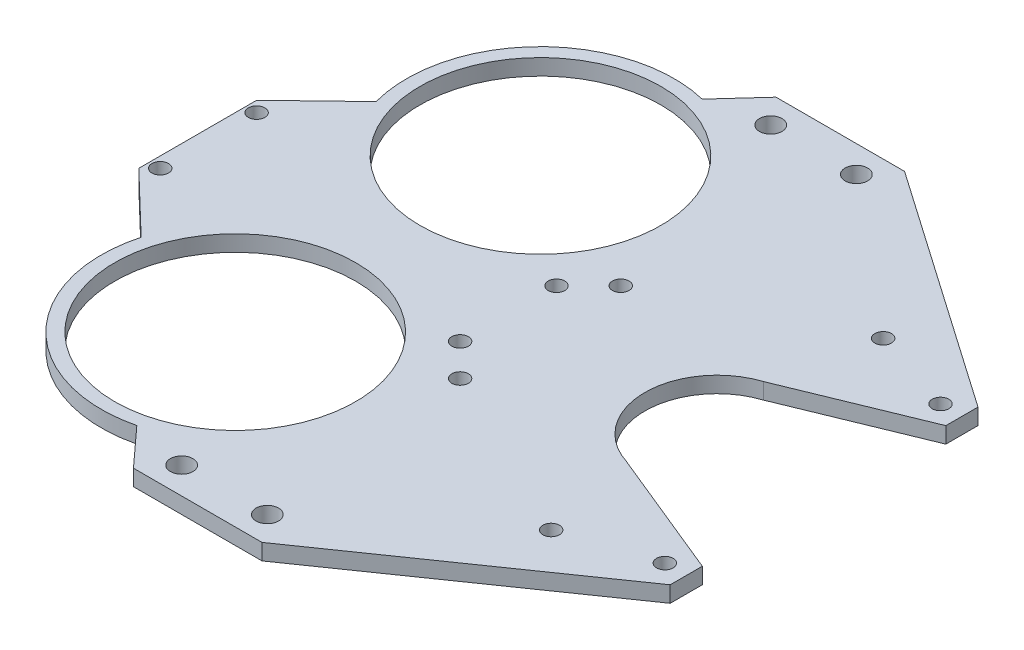
ISO-10303-21;
HEADER;
FILE_DESCRIPTION(('STEP AP214'),'2;1');
FILE_NAME('part.step','',(''),(''),'','','');
FILE_SCHEMA(('AUTOMOTIVE_DESIGN { 1 0 10303 214 1 1 1 1 }'));
ENDSEC;
DATA;
#1=APPLICATION_CONTEXT('core data for automotive mechanical design processes');
#2=APPLICATION_PROTOCOL_DEFINITION('international standard','automotive_design',2000,#1);
#3=PRODUCT_CONTEXT('',#1,'mechanical');
#4=PRODUCT('Part','Part','',(#3));
#5=PRODUCT_RELATED_PRODUCT_CATEGORY('part','',(#4));
#6=PRODUCT_DEFINITION_FORMATION('','',#4);
#7=PRODUCT_DEFINITION_CONTEXT('part definition',#1,'design');
#8=PRODUCT_DEFINITION('design','',#6,#7);
#9=PRODUCT_DEFINITION_SHAPE('','',#8);
#10=(LENGTH_UNIT() NAMED_UNIT(*) SI_UNIT(.MILLI.,.METRE.));
#11=(NAMED_UNIT(*) PLANE_ANGLE_UNIT() SI_UNIT($,.RADIAN.));
#12=(NAMED_UNIT(*) SI_UNIT($,.STERADIAN.) SOLID_ANGLE_UNIT());
#13=UNCERTAINTY_MEASURE_WITH_UNIT(LENGTH_MEASURE(1.E-05),#10,'distance_accuracy_value','');
#14=(GEOMETRIC_REPRESENTATION_CONTEXT(3) GLOBAL_UNCERTAINTY_ASSIGNED_CONTEXT((#13)) GLOBAL_UNIT_ASSIGNED_CONTEXT((#10,
#11,#12)) REPRESENTATION_CONTEXT('',''));
#15=CARTESIAN_POINT('',(0.,0.,0.));
#16=DIRECTION('',(0.,0.,1.));
#17=DIRECTION('',(1.,0.,0.));
#18=AXIS2_PLACEMENT_3D('',#15,#16,#17);
#19=CARTESIAN_POINT('',(0.,3.,0.));
#20=DIRECTION('',(0.,1.,0.));
#21=DIRECTION('',(0.,0.,1.));
#22=AXIS2_PLACEMENT_3D('',#19,#20,#21);
#23=PLANE('',#22);
#24=CARTESIAN_POINT('',(42.,3.,31.));
#25=DIRECTION('',(0.,-1.,0.));
#26=DIRECTION('',(0.,0.,-1.));
#27=AXIS2_PLACEMENT_3D('',#24,#25,#26);
#28=CIRCLE('',#27,1.55);
#29=CARTESIAN_POINT('',(42.,3.,29.45));
#30=VERTEX_POINT('',#29);
#31=EDGE_CURVE('E258',#30,#30,#28,.T.);
#32=ORIENTED_EDGE('',*,*,#31,.T.);
#33=EDGE_LOOP('',(#32));
#34=FACE_BOUND('',#33,.T.);
#35=CARTESIAN_POINT('',(9.,3.,15.));
#36=DIRECTION('',(0.,-1.,0.));
#37=DIRECTION('',(0.,0.,-1.));
#38=AXIS2_PLACEMENT_3D('',#35,#36,#37);
#39=CIRCLE('',#38,1.55);
#40=CARTESIAN_POINT('',(9.,3.,13.45));
#41=VERTEX_POINT('',#40);
#42=EDGE_CURVE('E263',#41,#41,#39,.T.);
#43=ORIENTED_EDGE('',*,*,#42,.T.);
#44=EDGE_LOOP('',(#43));
#45=FACE_BOUND('',#44,.T.);
#46=CARTESIAN_POINT('',(57.9755346439581,3.,25.7398332578328));
#47=DIRECTION('',(0.,-1.,0.));
#48=DIRECTION('',(0.,0.,-1.));
#49=AXIS2_PLACEMENT_3D('',#46,#47,#48);
#50=CIRCLE('',#49,1.55);
#51=CARTESIAN_POINT('',(57.9755346439581,3.,24.1898332578328));
#52=VERTEX_POINT('',#51);
#53=EDGE_CURVE('E255',#52,#52,#50,.T.);
#54=ORIENTED_EDGE('',*,*,#53,.T.);
#55=EDGE_LOOP('',(#54));
#56=FACE_BOUND('',#55,.T.);
#57=CARTESIAN_POINT('',(42.,3.,-31.));
#58=DIRECTION('',(0.,1.,0.));
#59=DIRECTION('',(0.,0.,1.));
#60=AXIS2_PLACEMENT_3D('',#57,#58,#59);
#61=CIRCLE('',#60,1.55);
#62=CARTESIAN_POINT('',(42.,3.,-29.45));
#63=VERTEX_POINT('',#62);
#64=EDGE_CURVE('E249',#63,#63,#61,.T.);
#65=ORIENTED_EDGE('',*,*,#64,.F.);
#66=EDGE_LOOP('',(#65));
#67=FACE_BOUND('',#66,.T.);
#68=CARTESIAN_POINT('',(9.,3.,-15.));
#69=DIRECTION('',(0.,1.,0.));
#70=DIRECTION('',(0.,0.,1.));
#71=AXIS2_PLACEMENT_3D('',#68,#69,#70);
#72=CIRCLE('',#71,1.55);
#73=CARTESIAN_POINT('',(9.,3.,-13.45));
#74=VERTEX_POINT('',#73);
#75=EDGE_CURVE('E254',#74,#74,#72,.T.);
#76=ORIENTED_EDGE('',*,*,#75,.F.);
#77=EDGE_LOOP('',(#76));
#78=FACE_BOUND('',#77,.T.);
#79=CARTESIAN_POINT('',(57.9755346439581,3.,-25.7398332578328));
#80=DIRECTION('',(0.,1.,0.));
#81=DIRECTION('',(0.,0.,1.));
#82=AXIS2_PLACEMENT_3D('',#79,#80,#81);
#83=CIRCLE('',#82,1.55);
#84=CARTESIAN_POINT('',(57.9755346439581,3.,-24.1898332578328));
#85=VERTEX_POINT('',#84);
#86=EDGE_CURVE('E244',#85,#85,#83,.T.);
#87=ORIENTED_EDGE('',*,*,#86,.F.);
#88=EDGE_LOOP('',(#87));
#89=FACE_BOUND('',#88,.T.);
#90=CARTESIAN_POINT('',(-53.,3.,-9.));
#91=DIRECTION('',(0.,1.,0.));
#92=DIRECTION('',(0.,0.,1.));
#93=AXIS2_PLACEMENT_3D('',#90,#91,#92);
#94=CIRCLE('',#93,1.55);
#95=CARTESIAN_POINT('',(-53.,3.,-7.45));
#96=VERTEX_POINT('',#95);
#97=EDGE_CURVE('E234',#96,#96,#94,.T.);
#98=ORIENTED_EDGE('',*,*,#97,.F.);
#99=EDGE_LOOP('',(#98));
#100=FACE_BOUND('',#99,.T.);
#101=CARTESIAN_POINT('',(3.,3.,-9.));
#102=DIRECTION('',(0.,1.,0.));
#103=DIRECTION('',(0.,0.,1.));
#104=AXIS2_PLACEMENT_3D('',#101,#102,#103);
#105=CIRCLE('',#104,1.55);
#106=CARTESIAN_POINT('',(3.,3.,-7.45));
#107=VERTEX_POINT('',#106);
#108=EDGE_CURVE('E280',#107,#107,#105,.T.);
#109=ORIENTED_EDGE('',*,*,#108,.F.);
#110=EDGE_LOOP('',(#109));
#111=FACE_BOUND('',#110,.T.);
#112=CARTESIAN_POINT('',(3.,3.,9.));
#113=DIRECTION('',(0.,1.,0.));
#114=DIRECTION('',(0.,0.,1.));
#115=AXIS2_PLACEMENT_3D('',#112,#113,#114);
#116=CIRCLE('',#115,1.55);
#117=CARTESIAN_POINT('',(3.,3.,10.55));
#118=VERTEX_POINT('',#117);
#119=EDGE_CURVE('E243',#118,#118,#116,.T.);
#120=ORIENTED_EDGE('',*,*,#119,.F.);
#121=EDGE_LOOP('',(#120));
#122=FACE_BOUND('',#121,.T.);
#123=CARTESIAN_POINT('',(-53.,3.,9.));
#124=DIRECTION('',(0.,1.,0.));
#125=DIRECTION('',(0.,0.,1.));
#126=AXIS2_PLACEMENT_3D('',#123,#124,#125);
#127=CIRCLE('',#126,1.55);
#128=CARTESIAN_POINT('',(-53.,3.,10.55));
#129=VERTEX_POINT('',#128);
#130=EDGE_CURVE('E229',#129,#129,#127,.T.);
#131=ORIENTED_EDGE('',*,*,#130,.F.);
#132=EDGE_LOOP('',(#131));
#133=FACE_BOUND('',#132,.T.);
#134=CARTESIAN_POINT('',(-19.5,3.,28.5));
#135=DIRECTION('',(0.,-1.,0.));
#136=DIRECTION('',(0.,0.,-1.));
#137=AXIS2_PLACEMENT_3D('',#134,#135,#136);
#138=CIRCLE('',#137,22.5);
#139=CARTESIAN_POINT('',(-19.5,3.,6.00000000000002));
#140=VERTEX_POINT('',#139);
#141=EDGE_CURVE('E296',#140,#140,#138,.T.);
#142=ORIENTED_EDGE('',*,*,#141,.T.);
#143=EDGE_LOOP('',(#142));
#144=FACE_BOUND('',#143,.T.);
#145=CARTESIAN_POINT('',(-19.5,3.,-28.5));
#146=DIRECTION('',(0.,1.,0.));
#147=DIRECTION('',(0.,0.,1.));
#148=AXIS2_PLACEMENT_3D('',#145,#146,#147);
#149=CIRCLE('',#148,22.5);
#150=CARTESIAN_POINT('',(-19.5,3.,-6.00000000000002));
#151=VERTEX_POINT('',#150);
#152=EDGE_CURVE('E300',#151,#151,#149,.T.);
#153=ORIENTED_EDGE('',*,*,#152,.F.);
#154=EDGE_LOOP('',(#153));
#155=FACE_BOUND('',#154,.T.);
#156=CARTESIAN_POINT('',(-3.00000000000002,3.,-55.));
#157=DIRECTION('',(0.,1.,0.));
#158=DIRECTION('',(0.,0.,1.));
#159=AXIS2_PLACEMENT_3D('',#156,#157,#158);
#160=CIRCLE('',#159,2.1);
#161=CARTESIAN_POINT('',(-3.00000000000002,3.,-52.9));
#162=VERTEX_POINT('',#161);
#163=EDGE_CURVE('E304',#162,#162,#160,.T.);
#164=ORIENTED_EDGE('',*,*,#163,.F.);
#165=EDGE_LOOP('',(#164));
#166=FACE_BOUND('',#165,.T.);
#167=CARTESIAN_POINT('',(13.,3.,-55.));
#168=DIRECTION('',(0.,1.,0.));
#169=DIRECTION('',(0.,0.,1.));
#170=AXIS2_PLACEMENT_3D('',#167,#168,#169);
#171=CIRCLE('',#170,2.1);
#172=CARTESIAN_POINT('',(13.,3.,-52.9));
#173=VERTEX_POINT('',#172);
#174=EDGE_CURVE('E308',#173,#173,#171,.T.);
#175=ORIENTED_EDGE('',*,*,#174,.F.);
#176=EDGE_LOOP('',(#175));
#177=FACE_BOUND('',#176,.T.);
#178=CARTESIAN_POINT('',(13.,3.,55.));
#179=DIRECTION('',(0.,-1.,0.));
#180=DIRECTION('',(0.,0.,-1.));
#181=AXIS2_PLACEMENT_3D('',#178,#179,#180);
#182=CIRCLE('',#181,2.1);
#183=CARTESIAN_POINT('',(13.,3.,52.9));
#184=VERTEX_POINT('',#183);
#185=EDGE_CURVE('E312',#184,#184,#182,.T.);
#186=ORIENTED_EDGE('',*,*,#185,.T.);
#187=EDGE_LOOP('',(#186));
#188=FACE_BOUND('',#187,.T.);
#189=CARTESIAN_POINT('',(-3.00000000000002,3.,55.));
#190=DIRECTION('',(0.,-1.,0.));
#191=DIRECTION('',(0.,0.,-1.));
#192=AXIS2_PLACEMENT_3D('',#189,#190,#191);
#193=CIRCLE('',#192,2.1);
#194=CARTESIAN_POINT('',(-3.00000000000002,3.,52.9));
#195=VERTEX_POINT('',#194);
#196=EDGE_CURVE('E315',#195,#195,#193,.T.);
#197=ORIENTED_EDGE('',*,*,#196,.T.);
#198=EDGE_LOOP('',(#197));
#199=FACE_BOUND('',#198,.T.);
#200=DIRECTION('',(-0.925256138398603,0.,0.379342956117159));
#201=VECTOR('',#200,1.);
#202=CARTESIAN_POINT('',(61.9755346439581,3.,-22.7398332578328));
#203=LINE('',#202,#201);
#204=CARTESIAN_POINT('',(61.9755346439581,3.00000000000003,-22.7398332578328));
#205=VERTEX_POINT('',#204);
#206=CARTESIAN_POINT('',(37.8222951308566,3.,-12.8373198926542));
#207=VERTEX_POINT('',#206);
#208=EDGE_CURVE('E53',#205,#207,#203,.T.);
#209=ORIENTED_EDGE('',*,*,#208,.F.);
#210=DIRECTION('',(0.,0.,1.));
#211=VECTOR('',#210,1.);
#212=CARTESIAN_POINT('',(61.9755346439581,3.,-28.7398332578328));
#213=LINE('',#212,#211);
#214=CARTESIAN_POINT('',(61.9755346439581,3.00000000000006,-28.7398332578328));
#215=VERTEX_POINT('',#214);
#216=EDGE_CURVE('E169',#215,#205,#213,.T.);
#217=ORIENTED_EDGE('',*,*,#216,.F.);
#218=DIRECTION('',(-0.821137607991091,0.,-0.570730259179123));
#219=VECTOR('',#218,1.);
#220=CARTESIAN_POINT('',(17.,3.,-60.));
#221=LINE('',#220,#219);
#222=CARTESIAN_POINT('',(17.,3.,-60.));
#223=VERTEX_POINT('',#222);
#224=EDGE_CURVE('E222',#215,#223,#221,.T.);
#225=ORIENTED_EDGE('',*,*,#224,.T.);
#226=DIRECTION('',(-1.,0.,0.));
#227=VECTOR('',#226,1.);
#228=CARTESIAN_POINT('',(17.,3.,-60.));
#229=LINE('',#228,#227);
#230=CARTESIAN_POINT('',(-7.00000000000002,3.,-60.));
#231=VERTEX_POINT('',#230);
#232=EDGE_CURVE('E350',#223,#231,#229,.T.);
#233=ORIENTED_EDGE('',*,*,#232,.T.);
#234=DIRECTION('',(-0.674073225767098,0.,0.738664528933087));
#235=VECTOR('',#234,1.);
#236=CARTESIAN_POINT('',(-7.00000000000002,3.,-60.));
#237=LINE('',#236,#235);
#238=CARTESIAN_POINT('',(-13.5803943583106,3.,-52.7890565697163));
#239=VERTEX_POINT('',#238);
#240=EDGE_CURVE('E356',#231,#239,#237,.T.);
#241=ORIENTED_EDGE('',*,*,#240,.T.);
#242=CARTESIAN_POINT('',(-19.5,3.,-28.5));
#243=DIRECTION('',(0.,1.,0.));
#244=DIRECTION('',(0.,0.,1.));
#245=AXIS2_PLACEMENT_3D('',#242,#243,#244);
#246=CIRCLE('',#245,25.);
#247=CARTESIAN_POINT('',(-43.624805935291,3.,-21.9430389215318));
#248=VERTEX_POINT('',#247);
#249=EDGE_CURVE('E391',#239,#248,#246,.T.);
#250=ORIENTED_EDGE('',*,*,#249,.T.);
#251=DIRECTION('',(0.720663628318464,0.,-0.693284887199243));
#252=VECTOR('',#251,1.);
#253=CARTESIAN_POINT('',(-31.9312936399787,3.,-33.1923028416974));
#254=LINE('',#253,#252);
#255=CARTESIAN_POINT('',(-55.,3.,-11.));
#256=VERTEX_POINT('',#255);
#257=EDGE_CURVE('E367',#256,#248,#254,.T.);
#258=ORIENTED_EDGE('',*,*,#257,.F.);
#259=DIRECTION('',(0.,0.,1.));
#260=VECTOR('',#259,1.);
#261=CARTESIAN_POINT('',(-55.,3.,0.));
#262=LINE('',#261,#260);
#263=CARTESIAN_POINT('',(-55.,3.,11.));
#264=VERTEX_POINT('',#263);
#265=EDGE_CURVE('E369',#256,#264,#262,.T.);
#266=ORIENTED_EDGE('',*,*,#265,.T.);
#267=DIRECTION('',(0.720663628318464,0.,0.693284887199243));
#268=VECTOR('',#267,1.);
#269=CARTESIAN_POINT('',(-31.9312936399787,3.,33.1923028416974));
#270=LINE('',#269,#268);
#271=CARTESIAN_POINT('',(-43.624805935291,3.,21.9430389215318));
#272=VERTEX_POINT('',#271);
#273=EDGE_CURVE('E372',#264,#272,#270,.T.);
#274=ORIENTED_EDGE('',*,*,#273,.T.);
#275=CARTESIAN_POINT('',(-19.5,3.,28.5));
#276=DIRECTION('',(0.,-1.,0.));
#277=DIRECTION('',(0.,0.,-1.));
#278=AXIS2_PLACEMENT_3D('',#275,#276,#277);
#279=CIRCLE('',#278,25.);
#280=CARTESIAN_POINT('',(-13.5803943583106,3.,52.7890565697163));
#281=VERTEX_POINT('',#280);
#282=EDGE_CURVE('E406',#281,#272,#279,.T.);
#283=ORIENTED_EDGE('',*,*,#282,.F.);
#284=DIRECTION('',(-0.674073225767098,0.,-0.738664528933087));
#285=VECTOR('',#284,1.);
#286=CARTESIAN_POINT('',(-7.00000000000002,3.,60.));
#287=LINE('',#286,#285);
#288=CARTESIAN_POINT('',(-7.00000000000002,3.,60.));
#289=VERTEX_POINT('',#288);
#290=EDGE_CURVE('E328',#289,#281,#287,.T.);
#291=ORIENTED_EDGE('',*,*,#290,.F.);
#292=DIRECTION('',(-1.,0.,0.));
#293=VECTOR('',#292,1.);
#294=CARTESIAN_POINT('',(17.,3.,60.));
#295=LINE('',#294,#293);
#296=CARTESIAN_POINT('',(17.,3.,60.));
#297=VERTEX_POINT('',#296);
#298=EDGE_CURVE('E334',#297,#289,#295,.T.);
#299=ORIENTED_EDGE('',*,*,#298,.F.);
#300=DIRECTION('',(0.821137607991222,0.,-0.570730259178934));
#301=VECTOR('',#300,1.);
#302=CARTESIAN_POINT('',(17.,3.,60.));
#303=LINE('',#302,#301);
#304=CARTESIAN_POINT('',(61.9755462252569,3.,28.7398211835021));
#305=VERTEX_POINT('',#304);
#306=EDGE_CURVE('E86',#297,#305,#303,.T.);
#307=ORIENTED_EDGE('',*,*,#306,.T.);
#308=DIRECTION('',(0.,0.,1.));
#309=VECTOR('',#308,1.);
#310=CARTESIAN_POINT('',(61.975534643958,3.,28.7398332578328));
#311=LINE('',#310,#309);
#312=CARTESIAN_POINT('',(61.975534643958,3.00000000000006,22.7398332578328));
#313=VERTEX_POINT('',#312);
#314=EDGE_CURVE('E76',#313,#305,#311,.T.);
#315=ORIENTED_EDGE('',*,*,#314,.F.);
#316=DIRECTION('',(0.925256138398603,0.,0.379342956117159));
#317=VECTOR('',#316,1.);
#318=CARTESIAN_POINT('',(61.975534643958,3.,22.7398332578328));
#319=LINE('',#318,#317);
#320=CARTESIAN_POINT('',(37.8222951308565,3.,12.8373198926542));
#321=VERTEX_POINT('',#320);
#322=EDGE_CURVE('E168',#321,#313,#319,.T.);
#323=ORIENTED_EDGE('',*,*,#322,.F.);
#324=CARTESIAN_POINT('',(42.,3.,0.));
#325=DIRECTION('',(0.,1.,0.));
#326=DIRECTION('',(0.,0.,1.));
#327=AXIS2_PLACEMENT_3D('',#324,#325,#326);
#328=CIRCLE('',#327,13.5);
#329=EDGE_CURVE('E164',#207,#321,#328,.T.);
#330=ORIENTED_EDGE('',*,*,#329,.F.);
#331=EDGE_LOOP('',(#209,#217,#225,#233,#241,#250,#258,#266,#274,#283,#291,#299,#307,#315,#323,#330));
#332=FACE_BOUND('',#331,.T.);
#333=ADVANCED_FACE('F36',(#34,#45,#56,#67,#78,#89,#100,#111,#122,#133,#144,#155,#166,#177,#188,
#199,#332),#23,.T.);
#334=CARTESIAN_POINT('',(42.,0.,0.));
#335=DIRECTION('',(0.,1.,0.));
#336=DIRECTION('',(0.,0.,1.));
#337=AXIS2_PLACEMENT_3D('',#334,#335,#336);
#338=CYLINDRICAL_SURFACE('',#337,13.5);
#339=DIRECTION('',(0.,1.,0.));
#340=VECTOR('',#339,1.);
#341=CARTESIAN_POINT('',(37.8222951308565,0.,12.8373198926542));
#342=LINE('',#341,#340);
#343=CARTESIAN_POINT('',(37.8222951308566,0.,12.8373198926542));
#344=VERTEX_POINT('',#343);
#345=EDGE_CURVE('E45',#344,#321,#342,.T.);
#346=ORIENTED_EDGE('',*,*,#345,.F.);
#347=CARTESIAN_POINT('',(42.,0.,0.));
#348=DIRECTION('',(0.,1.,0.));
#349=DIRECTION('',(0.,0.,1.));
#350=AXIS2_PLACEMENT_3D('',#347,#348,#349);
#351=CIRCLE('',#350,13.5);
#352=CARTESIAN_POINT('',(37.8222951308565,0.,-12.8373198926542));
#353=VERTEX_POINT('',#352);
#354=EDGE_CURVE('E152',#353,#344,#351,.T.);
#355=ORIENTED_EDGE('',*,*,#354,.F.);
#356=DIRECTION('',(0.,1.,0.));
#357=VECTOR('',#356,1.);
#358=CARTESIAN_POINT('',(37.8222951308566,0.,-12.8373198926542));
#359=LINE('',#358,#357);
#360=EDGE_CURVE('E11',#207,#353,#359,.F.);
#361=ORIENTED_EDGE('',*,*,#360,.F.);
#362=ORIENTED_EDGE('',*,*,#329,.T.);
#363=EDGE_LOOP('',(#346,#355,#361,#362));
#364=FACE_BOUND('',#363,.T.);
#365=ADVANCED_FACE('F161',(#364),#338,.F.);
#366=CARTESIAN_POINT('',(-31.9312936399787,3.,-33.1923028416974));
#367=DIRECTION('',(-0.693284887199243,0.,-0.720663628318464));
#368=DIRECTION('',(-0.720663628318464,0.,0.693284887199243));
#369=AXIS2_PLACEMENT_3D('',#366,#367,#368);
#370=PLANE('',#369);
#371=ORIENTED_EDGE('',*,*,#257,.T.);
#372=DIRECTION('',(0.,-1.,0.));
#373=VECTOR('',#372,1.);
#374=CARTESIAN_POINT('',(-43.624805935291,3.,-21.9430389215318));
#375=LINE('',#374,#373);
#376=CARTESIAN_POINT('',(-43.624805935291,0.,-21.9430389215318));
#377=VERTEX_POINT('',#376);
#378=EDGE_CURVE('E397',#248,#377,#375,.T.);
#379=ORIENTED_EDGE('',*,*,#378,.T.);
#380=DIRECTION('',(0.720663628318464,0.,-0.693284887199243));
#381=VECTOR('',#380,1.);
#382=CARTESIAN_POINT('',(-31.9312936399787,0.,-33.1923028416974));
#383=LINE('',#382,#381);
#384=CARTESIAN_POINT('',(-55.,0.,-11.));
#385=VERTEX_POINT('',#384);
#386=EDGE_CURVE('E365',#385,#377,#383,.T.);
#387=ORIENTED_EDGE('',*,*,#386,.F.);
#388=DIRECTION('',(0.,-1.,0.));
#389=VECTOR('',#388,1.);
#390=CARTESIAN_POINT('',(-55.,3.,-11.));
#391=LINE('',#390,#389);
#392=EDGE_CURVE('E383',#256,#385,#391,.T.);
#393=ORIENTED_EDGE('',*,*,#392,.F.);
#394=EDGE_LOOP('',(#371,#379,#387,#393));
#395=FACE_BOUND('',#394,.T.);
#396=ADVANCED_FACE('F38',(#395),#370,.T.);
#397=CARTESIAN_POINT('',(-7.00000000000002,0.,-60.));
#398=DIRECTION('',(-0.738664528933087,0.,-0.674073225767098));
#399=DIRECTION('',(-0.674073225767098,0.,0.738664528933087));
#400=AXIS2_PLACEMENT_3D('',#397,#398,#399);
#401=PLANE('',#400);
#402=DIRECTION('',(-0.674073225767098,0.,0.738664528933087));
#403=VECTOR('',#402,1.);
#404=CARTESIAN_POINT('',(-7.00000000000002,0.,-60.));
#405=LINE('',#404,#403);
#406=CARTESIAN_POINT('',(-7.00000000000002,0.,-60.));
#407=VERTEX_POINT('',#406);
#408=CARTESIAN_POINT('',(-13.5803943583106,0.,-52.7890565697163));
#409=VERTEX_POINT('',#408);
#410=EDGE_CURVE('E355',#407,#409,#405,.T.);
#411=ORIENTED_EDGE('',*,*,#410,.T.);
#412=DIRECTION('',(0.,-1.,0.));
#413=VECTOR('',#412,1.);
#414=CARTESIAN_POINT('',(-13.5803943583106,3.,-52.7890565697163));
#415=LINE('',#414,#413);
#416=EDGE_CURVE('E394',#239,#409,#415,.T.);
#417=ORIENTED_EDGE('',*,*,#416,.F.);
#418=ORIENTED_EDGE('',*,*,#240,.F.);
#419=DIRECTION('',(0.,1.,0.));
#420=VECTOR('',#419,1.);
#421=CARTESIAN_POINT('',(-7.00000000000002,0.,-60.));
#422=LINE('',#421,#420);
#423=EDGE_CURVE('E363',#407,#231,#422,.T.);
#424=ORIENTED_EDGE('',*,*,#423,.F.);
#425=EDGE_LOOP('',(#411,#417,#418,#424));
#426=FACE_BOUND('',#425,.T.);
#427=ADVANCED_FACE('F424',(#426),#401,.T.);
#428=CARTESIAN_POINT('',(0.,0.,0.));
#429=DIRECTION('',(0.,1.,0.));
#430=DIRECTION('',(0.,0.,1.));
#431=AXIS2_PLACEMENT_3D('',#428,#429,#430);
#432=PLANE('',#431);
#433=CARTESIAN_POINT('',(42.,0.,31.));
#434=DIRECTION('',(0.,1.,0.));
#435=DIRECTION('',(0.,0.,1.));
#436=AXIS2_PLACEMENT_3D('',#433,#434,#435);
#437=CIRCLE('',#436,1.55);
#438=CARTESIAN_POINT('',(42.,0.,32.55));
#439=VERTEX_POINT('',#438);
#440=EDGE_CURVE('E40',#439,#439,#437,.F.);
#441=ORIENTED_EDGE('',*,*,#440,.F.);
#442=EDGE_LOOP('',(#441));
#443=FACE_BOUND('',#442,.T.);
#444=CARTESIAN_POINT('',(9.,0.,15.));
#445=DIRECTION('',(0.,1.,0.));
#446=DIRECTION('',(0.,0.,1.));
#447=AXIS2_PLACEMENT_3D('',#444,#445,#446);
#448=CIRCLE('',#447,1.55);
#449=CARTESIAN_POINT('',(9.,0.,16.55));
#450=VERTEX_POINT('',#449);
#451=EDGE_CURVE('E256',#450,#450,#448,.F.);
#452=ORIENTED_EDGE('',*,*,#451,.F.);
#453=EDGE_LOOP('',(#452));
#454=FACE_BOUND('',#453,.T.);
#455=CARTESIAN_POINT('',(57.9755346439581,0.,25.7398332578328));
#456=DIRECTION('',(0.,1.,0.));
#457=DIRECTION('',(0.,0.,1.));
#458=AXIS2_PLACEMENT_3D('',#455,#456,#457);
#459=CIRCLE('',#458,1.55);
#460=CARTESIAN_POINT('',(57.9755346439581,0.,27.2898332578328));
#461=VERTEX_POINT('',#460);
#462=EDGE_CURVE('E252',#461,#461,#459,.F.);
#463=ORIENTED_EDGE('',*,*,#462,.F.);
#464=EDGE_LOOP('',(#463));
#465=FACE_BOUND('',#464,.T.);
#466=CARTESIAN_POINT('',(42.,0.,-31.));
#467=DIRECTION('',(0.,1.,0.));
#468=DIRECTION('',(0.,0.,1.));
#469=AXIS2_PLACEMENT_3D('',#466,#467,#468);
#470=CIRCLE('',#469,1.55);
#471=CARTESIAN_POINT('',(42.,0.,-29.45));
#472=VERTEX_POINT('',#471);
#473=EDGE_CURVE('E248',#472,#472,#470,.T.);
#474=ORIENTED_EDGE('',*,*,#473,.T.);
#475=EDGE_LOOP('',(#474));
#476=FACE_BOUND('',#475,.T.);
#477=CARTESIAN_POINT('',(9.,0.,-15.));
#478=DIRECTION('',(0.,1.,0.));
#479=DIRECTION('',(0.,0.,1.));
#480=AXIS2_PLACEMENT_3D('',#477,#478,#479);
#481=CIRCLE('',#480,1.55);
#482=CARTESIAN_POINT('',(9.,0.,-13.45));
#483=VERTEX_POINT('',#482);
#484=EDGE_CURVE('E245',#483,#483,#481,.T.);
#485=ORIENTED_EDGE('',*,*,#484,.T.);
#486=EDGE_LOOP('',(#485));
#487=FACE_BOUND('',#486,.T.);
#488=CARTESIAN_POINT('',(57.9755346439581,0.,-25.7398332578328));
#489=DIRECTION('',(0.,1.,0.));
#490=DIRECTION('',(0.,0.,1.));
#491=AXIS2_PLACEMENT_3D('',#488,#489,#490);
#492=CIRCLE('',#491,1.55);
#493=CARTESIAN_POINT('',(57.9755346439581,0.,-24.1898332578328));
#494=VERTEX_POINT('',#493);
#495=EDGE_CURVE('E240',#494,#494,#492,.T.);
#496=ORIENTED_EDGE('',*,*,#495,.T.);
#497=EDGE_LOOP('',(#496));
#498=FACE_BOUND('',#497,.T.);
#499=CARTESIAN_POINT('',(-53.,0.,-9.));
#500=DIRECTION('',(0.,1.,0.));
#501=DIRECTION('',(0.,0.,1.));
#502=AXIS2_PLACEMENT_3D('',#499,#500,#501);
#503=CIRCLE('',#502,1.55);
#504=CARTESIAN_POINT('',(-53.,0.,-7.45));
#505=VERTEX_POINT('',#504);
#506=EDGE_CURVE('E237',#505,#505,#503,.T.);
#507=ORIENTED_EDGE('',*,*,#506,.T.);
#508=EDGE_LOOP('',(#507));
#509=FACE_BOUND('',#508,.T.);
#510=CARTESIAN_POINT('',(3.,0.,-9.));
#511=DIRECTION('',(0.,1.,0.));
#512=DIRECTION('',(0.,0.,1.));
#513=AXIS2_PLACEMENT_3D('',#510,#511,#512);
#514=CIRCLE('',#513,1.55);
#515=CARTESIAN_POINT('',(3.,0.,-7.45));
#516=VERTEX_POINT('',#515);
#517=EDGE_CURVE('E233',#516,#516,#514,.T.);
#518=ORIENTED_EDGE('',*,*,#517,.T.);
#519=EDGE_LOOP('',(#518));
#520=FACE_BOUND('',#519,.T.);
#521=CARTESIAN_POINT('',(3.,0.,9.));
#522=DIRECTION('',(0.,1.,0.));
#523=DIRECTION('',(0.,0.,1.));
#524=AXIS2_PLACEMENT_3D('',#521,#522,#523);
#525=CIRCLE('',#524,1.55);
#526=CARTESIAN_POINT('',(3.,0.,10.55));
#527=VERTEX_POINT('',#526);
#528=EDGE_CURVE('E230',#527,#527,#525,.T.);
#529=ORIENTED_EDGE('',*,*,#528,.T.);
#530=EDGE_LOOP('',(#529));
#531=FACE_BOUND('',#530,.T.);
#532=CARTESIAN_POINT('',(-53.,0.,9.));
#533=DIRECTION('',(0.,1.,0.));
#534=DIRECTION('',(0.,0.,1.));
#535=AXIS2_PLACEMENT_3D('',#532,#533,#534);
#536=CIRCLE('',#535,1.55);
#537=CARTESIAN_POINT('',(-53.,0.,10.55));
#538=VERTEX_POINT('',#537);
#539=EDGE_CURVE('E225',#538,#538,#536,.T.);
#540=ORIENTED_EDGE('',*,*,#539,.T.);
#541=EDGE_LOOP('',(#540));
#542=FACE_BOUND('',#541,.T.);
#543=CARTESIAN_POINT('',(-19.5,0.,-28.5));
#544=DIRECTION('',(0.,1.,0.));
#545=DIRECTION('',(0.,0.,1.));
#546=AXIS2_PLACEMENT_3D('',#543,#544,#545);
#547=CIRCLE('',#546,22.5);
#548=CARTESIAN_POINT('',(-19.5,0.,-6.00000000000002));
#549=VERTEX_POINT('',#548);
#550=EDGE_CURVE('E399',#549,#549,#547,.T.);
#551=ORIENTED_EDGE('',*,*,#550,.T.);
#552=EDGE_LOOP('',(#551));
#553=FACE_BOUND('',#552,.T.);
#554=CARTESIAN_POINT('',(-19.5,0.,28.5));
#555=DIRECTION('',(0.,-1.,0.));
#556=DIRECTION('',(0.,0.,-1.));
#557=AXIS2_PLACEMENT_3D('',#554,#555,#556);
#558=CIRCLE('',#557,22.5);
#559=CARTESIAN_POINT('',(-19.5,0.,6.00000000000002));
#560=VERTEX_POINT('',#559);
#561=EDGE_CURVE('E321',#560,#560,#558,.T.);
#562=ORIENTED_EDGE('',*,*,#561,.F.);
#563=EDGE_LOOP('',(#562));
#564=FACE_BOUND('',#563,.T.);
#565=CARTESIAN_POINT('',(-3.00000000000002,0.,-55.));
#566=DIRECTION('',(0.,1.,0.));
#567=DIRECTION('',(0.,0.,1.));
#568=AXIS2_PLACEMENT_3D('',#565,#566,#567);
#569=CIRCLE('',#568,2.1);
#570=CARTESIAN_POINT('',(-3.00000000000002,0.,-52.9));
#571=VERTEX_POINT('',#570);
#572=EDGE_CURVE('E343',#571,#571,#569,.T.);
#573=ORIENTED_EDGE('',*,*,#572,.T.);
#574=EDGE_LOOP('',(#573));
#575=FACE_BOUND('',#574,.T.);
#576=CARTESIAN_POINT('',(13.,0.,-55.));
#577=DIRECTION('',(0.,1.,0.));
#578=DIRECTION('',(0.,0.,1.));
#579=AXIS2_PLACEMENT_3D('',#576,#577,#578);
#580=CIRCLE('',#579,2.1);
#581=CARTESIAN_POINT('',(13.,0.,-52.9));
#582=VERTEX_POINT('',#581);
#583=EDGE_CURVE('E347',#582,#582,#580,.T.);
#584=ORIENTED_EDGE('',*,*,#583,.T.);
#585=EDGE_LOOP('',(#584));
#586=FACE_BOUND('',#585,.T.);
#587=CARTESIAN_POINT('',(13.,0.,55.));
#588=DIRECTION('',(0.,-1.,0.));
#589=DIRECTION('',(0.,0.,-1.));
#590=AXIS2_PLACEMENT_3D('',#587,#588,#589);
#591=CIRCLE('',#590,2.1);
#592=CARTESIAN_POINT('',(13.,0.,52.9));
#593=VERTEX_POINT('',#592);
#594=EDGE_CURVE('E325',#593,#593,#591,.T.);
#595=ORIENTED_EDGE('',*,*,#594,.F.);
#596=EDGE_LOOP('',(#595));
#597=FACE_BOUND('',#596,.T.);
#598=CARTESIAN_POINT('',(-3.00000000000002,0.,55.));
#599=DIRECTION('',(0.,-1.,0.));
#600=DIRECTION('',(0.,0.,-1.));
#601=AXIS2_PLACEMENT_3D('',#598,#599,#600);
#602=CIRCLE('',#601,2.1);
#603=CARTESIAN_POINT('',(-3.00000000000002,0.,52.9));
#604=VERTEX_POINT('',#603);
#605=EDGE_CURVE('E317',#604,#604,#602,.T.);
#606=ORIENTED_EDGE('',*,*,#605,.F.);
#607=EDGE_LOOP('',(#606));
#608=FACE_BOUND('',#607,.T.);
#609=DIRECTION('',(-0.821137607991091,0.,-0.570730259179123));
#610=VECTOR('',#609,1.);
#611=CARTESIAN_POINT('',(17.,0.,-60.));
#612=LINE('',#611,#610);
#613=CARTESIAN_POINT('',(61.9755346439581,0.,-28.7398332578328));
#614=VERTEX_POINT('',#613);
#615=CARTESIAN_POINT('',(17.,0.,-60.));
#616=VERTEX_POINT('',#615);
#617=EDGE_CURVE('E218',#614,#616,#612,.T.);
#618=ORIENTED_EDGE('',*,*,#617,.F.);
#619=DIRECTION('',(0.,0.,1.));
#620=VECTOR('',#619,1.);
#621=CARTESIAN_POINT('',(61.9755346439581,0.,-28.7398332578328));
#622=LINE('',#621,#620);
#623=CARTESIAN_POINT('',(61.9755346439581,0.,-22.7398332578328));
#624=VERTEX_POINT('',#623);
#625=EDGE_CURVE('E62',#614,#624,#622,.T.);
#626=ORIENTED_EDGE('',*,*,#625,.T.);
#627=DIRECTION('',(-0.925256138398603,0.,0.379342956117159));
#628=VECTOR('',#627,1.);
#629=CARTESIAN_POINT('',(61.9755346439581,0.,-22.7398332578328));
#630=LINE('',#629,#628);
#631=EDGE_CURVE('E148',#624,#353,#630,.T.);
#632=ORIENTED_EDGE('',*,*,#631,.T.);
#633=ORIENTED_EDGE('',*,*,#354,.T.);
#634=DIRECTION('',(0.925256138398603,0.,0.379342956117159));
#635=VECTOR('',#634,1.);
#636=CARTESIAN_POINT('',(61.975534643958,0.,22.7398332578328));
#637=LINE('',#636,#635);
#638=CARTESIAN_POINT('',(61.975534643958,0.,22.7398332578328));
#639=VERTEX_POINT('',#638);
#640=EDGE_CURVE('E157',#344,#639,#637,.T.);
#641=ORIENTED_EDGE('',*,*,#640,.T.);
#642=DIRECTION('',(0.,0.,1.));
#643=VECTOR('',#642,1.);
#644=CARTESIAN_POINT('',(61.975534643958,0.,28.7398332578328));
#645=LINE('',#644,#643);
#646=CARTESIAN_POINT('',(61.9755462252569,0.,28.739825208279));
#647=VERTEX_POINT('',#646);
#648=EDGE_CURVE('E228',#639,#647,#645,.T.);
#649=ORIENTED_EDGE('',*,*,#648,.T.);
#650=DIRECTION('',(0.821137607991222,0.,-0.570730259178934));
#651=VECTOR('',#650,1.);
#652=CARTESIAN_POINT('',(17.,0.,60.));
#653=LINE('',#652,#651);
#654=CARTESIAN_POINT('',(17.,0.,60.));
#655=VERTEX_POINT('',#654);
#656=EDGE_CURVE('E531',#655,#647,#653,.T.);
#657=ORIENTED_EDGE('',*,*,#656,.F.);
#658=DIRECTION('',(-1.,0.,0.));
#659=VECTOR('',#658,1.);
#660=CARTESIAN_POINT('',(17.,0.,60.));
#661=LINE('',#660,#659);
#662=CARTESIAN_POINT('',(-7.00000000000002,0.,60.));
#663=VERTEX_POINT('',#662);
#664=EDGE_CURVE('E333',#655,#663,#661,.T.);
#665=ORIENTED_EDGE('',*,*,#664,.T.);
#666=DIRECTION('',(-0.674073225767098,0.,-0.738664528933087));
#667=VECTOR('',#666,1.);
#668=CARTESIAN_POINT('',(-7.00000000000002,0.,60.));
#669=LINE('',#668,#667);
#670=CARTESIAN_POINT('',(-13.5803943583106,0.,52.7890565697163));
#671=VERTEX_POINT('',#670);
#672=EDGE_CURVE('E330',#663,#671,#669,.T.);
#673=ORIENTED_EDGE('',*,*,#672,.T.);
#674=CARTESIAN_POINT('',(-19.5,0.,28.5));
#675=DIRECTION('',(0.,-1.,0.));
#676=DIRECTION('',(0.,0.,-1.));
#677=AXIS2_PLACEMENT_3D('',#674,#675,#676);
#678=CIRCLE('',#677,25.);
#679=CARTESIAN_POINT('',(-43.624805935291,0.,21.9430389215318));
#680=VERTEX_POINT('',#679);
#681=EDGE_CURVE('E403',#671,#680,#678,.T.);
#682=ORIENTED_EDGE('',*,*,#681,.T.);
#683=DIRECTION('',(0.720663628318464,0.,0.693284887199243));
#684=VECTOR('',#683,1.);
#685=CARTESIAN_POINT('',(-31.9312936399787,0.,33.1923028416974));
#686=LINE('',#685,#684);
#687=CARTESIAN_POINT('',(-55.,0.,11.));
#688=VERTEX_POINT('',#687);
#689=EDGE_CURVE('E370',#688,#680,#686,.T.);
#690=ORIENTED_EDGE('',*,*,#689,.F.);
#691=DIRECTION('',(0.,0.,1.));
#692=VECTOR('',#691,1.);
#693=CARTESIAN_POINT('',(-55.,0.,0.));
#694=LINE('',#693,#692);
#695=EDGE_CURVE('E378',#385,#688,#694,.T.);
#696=ORIENTED_EDGE('',*,*,#695,.F.);
#697=ORIENTED_EDGE('',*,*,#386,.T.);
#698=CARTESIAN_POINT('',(-19.5,0.,-28.5));
#699=DIRECTION('',(0.,1.,0.));
#700=DIRECTION('',(0.,0.,1.));
#701=AXIS2_PLACEMENT_3D('',#698,#699,#700);
#702=CIRCLE('',#701,25.);
#703=EDGE_CURVE('E163',#409,#377,#702,.T.);
#704=ORIENTED_EDGE('',*,*,#703,.F.);
#705=ORIENTED_EDGE('',*,*,#410,.F.);
#706=DIRECTION('',(-1.,0.,0.));
#707=VECTOR('',#706,1.);
#708=CARTESIAN_POINT('',(17.,0.,-60.));
#709=LINE('',#708,#707);
#710=EDGE_CURVE('E352',#616,#407,#709,.T.);
#711=ORIENTED_EDGE('',*,*,#710,.F.);
#712=EDGE_LOOP('',(#618,#626,#632,#633,#641,#649,#657,#665,#673,#682,#690,#696,#697,#704,#705,#711));
#713=FACE_BOUND('',#712,.T.);
#714=ADVANCED_FACE('F150',(#443,#454,#465,#476,#487,#498,#509,#520,#531,#542,#553,#564,#575,
#586,#597,#608,#713),#432,.F.);
#715=CARTESIAN_POINT('',(-31.9312936399787,3.,33.1923028416974));
#716=DIRECTION('',(0.693284887199243,0.,-0.720663628318464));
#717=DIRECTION('',(-0.720663628318464,0.,-0.693284887199243));
#718=AXIS2_PLACEMENT_3D('',#715,#716,#717);
#719=PLANE('',#718);
#720=ORIENTED_EDGE('',*,*,#689,.T.);
#721=DIRECTION('',(0.,-1.,0.));
#722=VECTOR('',#721,1.);
#723=CARTESIAN_POINT('',(-43.624805935291,3.,21.9430389215318));
#724=LINE('',#723,#722);
#725=EDGE_CURVE('E409',#272,#680,#724,.T.);
#726=ORIENTED_EDGE('',*,*,#725,.F.);
#727=ORIENTED_EDGE('',*,*,#273,.F.);
#728=DIRECTION('',(0.,-1.,0.));
#729=VECTOR('',#728,1.);
#730=CARTESIAN_POINT('',(-55.,3.,11.));
#731=LINE('',#730,#729);
#732=EDGE_CURVE('E375',#264,#688,#731,.T.);
#733=ORIENTED_EDGE('',*,*,#732,.T.);
#734=EDGE_LOOP('',(#720,#726,#727,#733));
#735=FACE_BOUND('',#734,.T.);
#736=ADVANCED_FACE('F423',(#735),#719,.F.);
#737=CARTESIAN_POINT('',(-55.,3.,0.));
#738=DIRECTION('',(1.,0.,0.));
#739=DIRECTION('',(0.,0.,-1.));
#740=AXIS2_PLACEMENT_3D('',#737,#738,#739);
#741=PLANE('',#740);
#742=ORIENTED_EDGE('',*,*,#695,.T.);
#743=ORIENTED_EDGE('',*,*,#732,.F.);
#744=ORIENTED_EDGE('',*,*,#265,.F.);
#745=ORIENTED_EDGE('',*,*,#392,.T.);
#746=EDGE_LOOP('',(#742,#743,#744,#745));
#747=FACE_BOUND('',#746,.T.);
#748=ADVANCED_FACE('F470',(#747),#741,.F.);
#749=CARTESIAN_POINT('',(17.,0.,-60.));
#750=DIRECTION('',(0.,0.,-1.));
#751=DIRECTION('',(-1.,0.,0.));
#752=AXIS2_PLACEMENT_3D('',#749,#750,#751);
#753=PLANE('',#752);
#754=ORIENTED_EDGE('',*,*,#232,.F.);
#755=DIRECTION('',(0.,1.,0.));
#756=VECTOR('',#755,1.);
#757=CARTESIAN_POINT('',(17.,0.,-60.));
#758=LINE('',#757,#756);
#759=EDGE_CURVE('E358',#616,#223,#758,.T.);
#760=ORIENTED_EDGE('',*,*,#759,.F.);
#761=ORIENTED_EDGE('',*,*,#710,.T.);
#762=ORIENTED_EDGE('',*,*,#423,.T.);
#763=EDGE_LOOP('',(#754,#760,#761,#762));
#764=FACE_BOUND('',#763,.T.);
#765=ADVANCED_FACE('F464',(#764),#753,.T.);
#766=CARTESIAN_POINT('',(13.,0.,-55.));
#767=DIRECTION('',(0.,1.,0.));
#768=DIRECTION('',(0.,0.,1.));
#769=AXIS2_PLACEMENT_3D('',#766,#767,#768);
#770=CYLINDRICAL_SURFACE('',#769,2.1);
#771=ORIENTED_EDGE('',*,*,#583,.F.);
#772=EDGE_LOOP('',(#771));
#773=FACE_BOUND('',#772,.T.);
#774=ORIENTED_EDGE('',*,*,#174,.T.);
#775=EDGE_LOOP('',(#774));
#776=FACE_BOUND('',#775,.T.);
#777=ADVANCED_FACE('F460',(#773,#776),#770,.F.);
#778=CARTESIAN_POINT('',(-3.00000000000002,0.,-55.));
#779=DIRECTION('',(0.,1.,0.));
#780=DIRECTION('',(0.,0.,1.));
#781=AXIS2_PLACEMENT_3D('',#778,#779,#780);
#782=CYLINDRICAL_SURFACE('',#781,2.1);
#783=ORIENTED_EDGE('',*,*,#572,.F.);
#784=EDGE_LOOP('',(#783));
#785=FACE_BOUND('',#784,.T.);
#786=ORIENTED_EDGE('',*,*,#163,.T.);
#787=EDGE_LOOP('',(#786));
#788=FACE_BOUND('',#787,.T.);
#789=ADVANCED_FACE('F456',(#785,#788),#782,.F.);
#790=CARTESIAN_POINT('',(-7.00000000000002,0.,60.));
#791=DIRECTION('',(0.738664528933087,0.,-0.674073225767098));
#792=DIRECTION('',(-0.674073225767098,0.,-0.738664528933087));
#793=AXIS2_PLACEMENT_3D('',#790,#791,#792);
#794=PLANE('',#793);
#795=ORIENTED_EDGE('',*,*,#290,.T.);
#796=DIRECTION('',(0.,-1.,0.));
#797=VECTOR('',#796,1.);
#798=CARTESIAN_POINT('',(-13.5803943583106,3.,52.7890565697163));
#799=LINE('',#798,#797);
#800=EDGE_CURVE('E412',#281,#671,#799,.T.);
#801=ORIENTED_EDGE('',*,*,#800,.T.);
#802=ORIENTED_EDGE('',*,*,#672,.F.);
#803=DIRECTION('',(0.,1.,0.));
#804=VECTOR('',#803,1.);
#805=CARTESIAN_POINT('',(-7.00000000000002,0.,60.));
#806=LINE('',#805,#804);
#807=EDGE_CURVE('E336',#663,#289,#806,.T.);
#808=ORIENTED_EDGE('',*,*,#807,.T.);
#809=EDGE_LOOP('',(#795,#801,#802,#808));
#810=FACE_BOUND('',#809,.T.);
#811=ADVANCED_FACE('F452',(#810),#794,.F.);
#812=CARTESIAN_POINT('',(17.,0.,60.));
#813=DIRECTION('',(0.,0.,-1.));
#814=DIRECTION('',(-1.,0.,0.));
#815=AXIS2_PLACEMENT_3D('',#812,#813,#814);
#816=PLANE('',#815);
#817=ORIENTED_EDGE('',*,*,#298,.T.);
#818=ORIENTED_EDGE('',*,*,#807,.F.);
#819=ORIENTED_EDGE('',*,*,#664,.F.);
#820=DIRECTION('',(0.,1.,0.));
#821=VECTOR('',#820,1.);
#822=CARTESIAN_POINT('',(17.,0.,60.));
#823=LINE('',#822,#821);
#824=EDGE_CURVE('E339',#655,#297,#823,.T.);
#825=ORIENTED_EDGE('',*,*,#824,.T.);
#826=EDGE_LOOP('',(#817,#818,#819,#825));
#827=FACE_BOUND('',#826,.T.);
#828=ADVANCED_FACE('F445',(#827),#816,.F.);
#829=CARTESIAN_POINT('',(13.,0.,55.));
#830=DIRECTION('',(0.,1.,0.));
#831=DIRECTION('',(0.,0.,1.));
#832=AXIS2_PLACEMENT_3D('',#829,#830,#831);
#833=CYLINDRICAL_SURFACE('',#832,2.1);
#834=ORIENTED_EDGE('',*,*,#594,.T.);
#835=EDGE_LOOP('',(#834));
#836=FACE_BOUND('',#835,.T.);
#837=ORIENTED_EDGE('',*,*,#185,.F.);
#838=EDGE_LOOP('',(#837));
#839=FACE_BOUND('',#838,.T.);
#840=ADVANCED_FACE('F437',(#836,#839),#833,.F.);
#841=CARTESIAN_POINT('',(-3.00000000000002,0.,55.));
#842=DIRECTION('',(0.,1.,0.));
#843=DIRECTION('',(0.,0.,1.));
#844=AXIS2_PLACEMENT_3D('',#841,#842,#843);
#845=CYLINDRICAL_SURFACE('',#844,2.1);
#846=ORIENTED_EDGE('',*,*,#605,.T.);
#847=EDGE_LOOP('',(#846));
#848=FACE_BOUND('',#847,.T.);
#849=ORIENTED_EDGE('',*,*,#196,.F.);
#850=EDGE_LOOP('',(#849));
#851=FACE_BOUND('',#850,.T.);
#852=ADVANCED_FACE('F435',(#848,#851),#845,.F.);
#853=CARTESIAN_POINT('',(-19.5,3.,28.5));
#854=DIRECTION('',(0.,-1.,0.));
#855=DIRECTION('',(0.,0.,-1.));
#856=AXIS2_PLACEMENT_3D('',#853,#854,#855);
#857=CYLINDRICAL_SURFACE('',#856,22.5);
#858=ORIENTED_EDGE('',*,*,#561,.T.);
#859=EDGE_LOOP('',(#858));
#860=FACE_BOUND('',#859,.T.);
#861=ORIENTED_EDGE('',*,*,#141,.F.);
#862=EDGE_LOOP('',(#861));
#863=FACE_BOUND('',#862,.T.);
#864=ADVANCED_FACE('F418',(#860,#863),#857,.F.);
#865=CARTESIAN_POINT('',(-19.5,3.,28.5));
#866=DIRECTION('',(0.,-1.,0.));
#867=DIRECTION('',(0.,0.,-1.));
#868=AXIS2_PLACEMENT_3D('',#865,#866,#867);
#869=CYLINDRICAL_SURFACE('',#868,25.);
#870=ORIENTED_EDGE('',*,*,#681,.F.);
#871=ORIENTED_EDGE('',*,*,#800,.F.);
#872=ORIENTED_EDGE('',*,*,#282,.T.);
#873=ORIENTED_EDGE('',*,*,#725,.T.);
#874=EDGE_LOOP('',(#870,#871,#872,#873));
#875=FACE_BOUND('',#874,.T.);
#876=ADVANCED_FACE('F443',(#875),#869,.T.);
#877=CARTESIAN_POINT('',(-19.5,3.,-28.5));
#878=DIRECTION('',(0.,-1.,0.));
#879=DIRECTION('',(0.,0.,-1.));
#880=AXIS2_PLACEMENT_3D('',#877,#878,#879);
#881=CYLINDRICAL_SURFACE('',#880,22.5);
#882=ORIENTED_EDGE('',*,*,#550,.F.);
#883=EDGE_LOOP('',(#882));
#884=FACE_BOUND('',#883,.T.);
#885=ORIENTED_EDGE('',*,*,#152,.T.);
#886=EDGE_LOOP('',(#885));
#887=FACE_BOUND('',#886,.T.);
#888=ADVANCED_FACE('F552',(#884,#887),#881,.F.);
#889=CARTESIAN_POINT('',(-19.5,3.,-28.5));
#890=DIRECTION('',(0.,-1.,0.));
#891=DIRECTION('',(0.,0.,-1.));
#892=AXIS2_PLACEMENT_3D('',#889,#890,#891);
#893=CYLINDRICAL_SURFACE('',#892,25.);
#894=ORIENTED_EDGE('',*,*,#703,.T.);
#895=ORIENTED_EDGE('',*,*,#378,.F.);
#896=ORIENTED_EDGE('',*,*,#249,.F.);
#897=ORIENTED_EDGE('',*,*,#416,.T.);
#898=EDGE_LOOP('',(#894,#895,#896,#897));
#899=FACE_BOUND('',#898,.T.);
#900=ADVANCED_FACE('F498',(#899),#893,.T.);
#901=CARTESIAN_POINT('',(17.,0.,-60.));
#902=DIRECTION('',(0.570730259179123,0.,-0.821137607991091));
#903=DIRECTION('',(-0.821137607991091,0.,-0.570730259179123));
#904=AXIS2_PLACEMENT_3D('',#901,#902,#903);
#905=PLANE('',#904);
#906=ORIENTED_EDGE('',*,*,#224,.F.);
#907=DIRECTION('',(0.,1.,0.));
#908=VECTOR('',#907,1.);
#909=CARTESIAN_POINT('',(61.9755346439581,0.,-28.7398332578328));
#910=LINE('',#909,#908);
#911=EDGE_CURVE('E210',#614,#215,#910,.T.);
#912=ORIENTED_EDGE('',*,*,#911,.F.);
#913=ORIENTED_EDGE('',*,*,#617,.T.);
#914=ORIENTED_EDGE('',*,*,#759,.T.);
#915=EDGE_LOOP('',(#906,#912,#913,#914));
#916=FACE_BOUND('',#915,.T.);
#917=ADVANCED_FACE('F202',(#916),#905,.T.);
#918=CARTESIAN_POINT('',(17.,0.,60.));
#919=DIRECTION('',(0.570730259178934,0.,0.821137607991222));
#920=DIRECTION('',(0.821137607991222,0.,-0.570730259178934));
#921=AXIS2_PLACEMENT_3D('',#918,#919,#920);
#922=PLANE('',#921);
#923=ORIENTED_EDGE('',*,*,#306,.F.);
#924=ORIENTED_EDGE('',*,*,#824,.F.);
#925=ORIENTED_EDGE('',*,*,#656,.T.);
#926=CARTESIAN_POINT('',(61.9755578065557,0.,28.7398171587252));
#927=DIRECTION('',(0.,1.,0.));
#928=VECTOR('',#927,1.);
#929=LINE('',#926,#928);
#930=EDGE_CURVE('E179',#647,#305,#929,.T.);
#931=ORIENTED_EDGE('',*,*,#930,.T.);
#932=EDGE_LOOP('',(#923,#924,#925,#931));
#933=FACE_BOUND('',#932,.T.);
#934=ADVANCED_FACE('F197',(#933),#922,.T.);
#935=CARTESIAN_POINT('',(61.975534643958,226.022560517989,28.7398332578328));
#936=DIRECTION('',(1.,0.,0.));
#937=DIRECTION('',(0.,0.,-1.));
#938=AXIS2_PLACEMENT_3D('',#935,#936,#937);
#939=PLANE('',#938);
#940=DIRECTION('',(0.,-1.,0.));
#941=VECTOR('',#940,1.);
#942=CARTESIAN_POINT('',(61.975534643958,226.022560517989,22.7398332578328));
#943=LINE('',#942,#941);
#944=EDGE_CURVE('E509',#313,#639,#943,.T.);
#945=ORIENTED_EDGE('',*,*,#944,.F.);
#946=ORIENTED_EDGE('',*,*,#314,.T.);
#947=ORIENTED_EDGE('',*,*,#930,.F.);
#948=ORIENTED_EDGE('',*,*,#648,.F.);
#949=EDGE_LOOP('',(#945,#946,#947,#948));
#950=FACE_BOUND('',#949,.T.);
#951=ADVANCED_FACE('F186',(#950),#939,.T.);
#952=CARTESIAN_POINT('',(61.975534643958,226.022560517989,22.7398332578328));
#953=DIRECTION('',(0.379342956117159,0.,-0.925256138398603));
#954=DIRECTION('',(-0.925256138398603,0.,-0.379342956117159));
#955=AXIS2_PLACEMENT_3D('',#952,#953,#954);
#956=PLANE('',#955);
#957=ORIENTED_EDGE('',*,*,#640,.F.);
#958=ORIENTED_EDGE('',*,*,#345,.T.);
#959=ORIENTED_EDGE('',*,*,#322,.T.);
#960=ORIENTED_EDGE('',*,*,#944,.T.);
#961=EDGE_LOOP('',(#957,#958,#959,#960));
#962=FACE_BOUND('',#961,.T.);
#963=ADVANCED_FACE('F196',(#962),#956,.T.);
#964=CARTESIAN_POINT('',(61.9755346439581,226.022560517989,-22.7398332578328));
#965=DIRECTION('',(0.379342956117159,0.,0.925256138398603));
#966=DIRECTION('',(0.925256138398603,0.,-0.379342956117159));
#967=AXIS2_PLACEMENT_3D('',#964,#965,#966);
#968=PLANE('',#967);
#969=ORIENTED_EDGE('',*,*,#208,.T.);
#970=ORIENTED_EDGE('',*,*,#360,.T.);
#971=ORIENTED_EDGE('',*,*,#631,.F.);
#972=DIRECTION('',(0.,-1.,0.));
#973=VECTOR('',#972,1.);
#974=CARTESIAN_POINT('',(61.9755346439581,226.022560517989,-22.7398332578328));
#975=LINE('',#974,#973);
#976=EDGE_CURVE('E167',#205,#624,#975,.T.);
#977=ORIENTED_EDGE('',*,*,#976,.F.);
#978=EDGE_LOOP('',(#969,#970,#971,#977));
#979=FACE_BOUND('',#978,.T.);
#980=ADVANCED_FACE('F166',(#979),#968,.T.);
#981=CARTESIAN_POINT('',(61.9755346439581,226.022560517989,-28.7398332578328));
#982=DIRECTION('',(1.,0.,0.));
#983=DIRECTION('',(0.,0.,-1.));
#984=AXIS2_PLACEMENT_3D('',#981,#982,#983);
#985=PLANE('',#984);
#986=ORIENTED_EDGE('',*,*,#911,.T.);
#987=ORIENTED_EDGE('',*,*,#216,.T.);
#988=ORIENTED_EDGE('',*,*,#976,.T.);
#989=ORIENTED_EDGE('',*,*,#625,.F.);
#990=EDGE_LOOP('',(#986,#987,#988,#989));
#991=FACE_BOUND('',#990,.T.);
#992=ADVANCED_FACE('F507',(#991),#985,.T.);
#993=CARTESIAN_POINT('',(-53.,-7.,9.));
#994=DIRECTION('',(0.,1.,0.));
#995=DIRECTION('',(0.,0.,1.));
#996=AXIS2_PLACEMENT_3D('',#993,#994,#995);
#997=CYLINDRICAL_SURFACE('',#996,1.55);
#998=ORIENTED_EDGE('',*,*,#130,.T.);
#999=EDGE_LOOP('',(#998));
#1000=FACE_BOUND('',#999,.T.);
#1001=ORIENTED_EDGE('',*,*,#539,.F.);
#1002=EDGE_LOOP('',(#1001));
#1003=FACE_BOUND('',#1002,.T.);
#1004=ADVANCED_FACE('F287',(#1000,#1003),#997,.F.);
#1005=CARTESIAN_POINT('',(3.,-7.,9.));
#1006=DIRECTION('',(0.,1.,0.));
#1007=DIRECTION('',(0.,0.,1.));
#1008=AXIS2_PLACEMENT_3D('',#1005,#1006,#1007);
#1009=CYLINDRICAL_SURFACE('',#1008,1.55);
#1010=ORIENTED_EDGE('',*,*,#119,.T.);
#1011=EDGE_LOOP('',(#1010));
#1012=FACE_BOUND('',#1011,.T.);
#1013=ORIENTED_EDGE('',*,*,#528,.F.);
#1014=EDGE_LOOP('',(#1013));
#1015=FACE_BOUND('',#1014,.T.);
#1016=ADVANCED_FACE('F648',(#1012,#1015),#1009,.F.);
#1017=CARTESIAN_POINT('',(3.,-7.,-9.));
#1018=DIRECTION('',(0.,1.,0.));
#1019=DIRECTION('',(0.,0.,1.));
#1020=AXIS2_PLACEMENT_3D('',#1017,#1018,#1019);
#1021=CYLINDRICAL_SURFACE('',#1020,1.55);
#1022=ORIENTED_EDGE('',*,*,#108,.T.);
#1023=EDGE_LOOP('',(#1022));
#1024=FACE_BOUND('',#1023,.T.);
#1025=ORIENTED_EDGE('',*,*,#517,.F.);
#1026=EDGE_LOOP('',(#1025));
#1027=FACE_BOUND('',#1026,.T.);
#1028=ADVANCED_FACE('F657',(#1024,#1027),#1021,.F.);
#1029=CARTESIAN_POINT('',(-53.,-7.,-9.));
#1030=DIRECTION('',(0.,1.,0.));
#1031=DIRECTION('',(0.,0.,1.));
#1032=AXIS2_PLACEMENT_3D('',#1029,#1030,#1031);
#1033=CYLINDRICAL_SURFACE('',#1032,1.55);
#1034=ORIENTED_EDGE('',*,*,#97,.T.);
#1035=EDGE_LOOP('',(#1034));
#1036=FACE_BOUND('',#1035,.T.);
#1037=ORIENTED_EDGE('',*,*,#506,.F.);
#1038=EDGE_LOOP('',(#1037));
#1039=FACE_BOUND('',#1038,.T.);
#1040=ADVANCED_FACE('F667',(#1036,#1039),#1033,.F.);
#1041=CARTESIAN_POINT('',(57.9755346439581,-7.,-25.7398332578328));
#1042=DIRECTION('',(0.,1.,0.));
#1043=DIRECTION('',(0.,0.,1.));
#1044=AXIS2_PLACEMENT_3D('',#1041,#1042,#1043);
#1045=CYLINDRICAL_SURFACE('',#1044,1.55);
#1046=ORIENTED_EDGE('',*,*,#86,.T.);
#1047=EDGE_LOOP('',(#1046));
#1048=FACE_BOUND('',#1047,.T.);
#1049=ORIENTED_EDGE('',*,*,#495,.F.);
#1050=EDGE_LOOP('',(#1049));
#1051=FACE_BOUND('',#1050,.T.);
#1052=ADVANCED_FACE('F677',(#1048,#1051),#1045,.F.);
#1053=CARTESIAN_POINT('',(9.,-7.,-15.));
#1054=DIRECTION('',(0.,1.,0.));
#1055=DIRECTION('',(0.,0.,1.));
#1056=AXIS2_PLACEMENT_3D('',#1053,#1054,#1055);
#1057=CYLINDRICAL_SURFACE('',#1056,1.55);
#1058=ORIENTED_EDGE('',*,*,#75,.T.);
#1059=EDGE_LOOP('',(#1058));
#1060=FACE_BOUND('',#1059,.T.);
#1061=ORIENTED_EDGE('',*,*,#484,.F.);
#1062=EDGE_LOOP('',(#1061));
#1063=FACE_BOUND('',#1062,.T.);
#1064=ADVANCED_FACE('F688',(#1060,#1063),#1057,.F.);
#1065=CARTESIAN_POINT('',(42.,-7.,-31.));
#1066=DIRECTION('',(0.,1.,0.));
#1067=DIRECTION('',(0.,0.,1.));
#1068=AXIS2_PLACEMENT_3D('',#1065,#1066,#1067);
#1069=CYLINDRICAL_SURFACE('',#1068,1.55);
#1070=ORIENTED_EDGE('',*,*,#64,.T.);
#1071=EDGE_LOOP('',(#1070));
#1072=FACE_BOUND('',#1071,.T.);
#1073=ORIENTED_EDGE('',*,*,#473,.F.);
#1074=EDGE_LOOP('',(#1073));
#1075=FACE_BOUND('',#1074,.T.);
#1076=ADVANCED_FACE('F699',(#1072,#1075),#1069,.F.);
#1077=CARTESIAN_POINT('',(57.9755346439581,-7.,25.7398332578328));
#1078=DIRECTION('',(0.,1.,0.));
#1079=DIRECTION('',(0.,0.,1.));
#1080=AXIS2_PLACEMENT_3D('',#1077,#1078,#1079);
#1081=CYLINDRICAL_SURFACE('',#1080,1.55);
#1082=ORIENTED_EDGE('',*,*,#53,.F.);
#1083=EDGE_LOOP('',(#1082));
#1084=FACE_BOUND('',#1083,.T.);
#1085=ORIENTED_EDGE('',*,*,#462,.T.);
#1086=EDGE_LOOP('',(#1085));
#1087=FACE_BOUND('',#1086,.T.);
#1088=ADVANCED_FACE('F709',(#1084,#1087),#1081,.F.);
#1089=CARTESIAN_POINT('',(9.,-7.,15.));
#1090=DIRECTION('',(0.,1.,0.));
#1091=DIRECTION('',(0.,0.,1.));
#1092=AXIS2_PLACEMENT_3D('',#1089,#1090,#1091);
#1093=CYLINDRICAL_SURFACE('',#1092,1.55);
#1094=ORIENTED_EDGE('',*,*,#42,.F.);
#1095=EDGE_LOOP('',(#1094));
#1096=FACE_BOUND('',#1095,.T.);
#1097=ORIENTED_EDGE('',*,*,#451,.T.);
#1098=EDGE_LOOP('',(#1097));
#1099=FACE_BOUND('',#1098,.T.);
#1100=ADVANCED_FACE('F729',(#1096,#1099),#1093,.F.);
#1101=CARTESIAN_POINT('',(42.,-7.,31.));
#1102=DIRECTION('',(0.,1.,0.));
#1103=DIRECTION('',(0.,0.,1.));
#1104=AXIS2_PLACEMENT_3D('',#1101,#1102,#1103);
#1105=CYLINDRICAL_SURFACE('',#1104,1.55);
#1106=ORIENTED_EDGE('',*,*,#31,.F.);
#1107=EDGE_LOOP('',(#1106));
#1108=FACE_BOUND('',#1107,.T.);
#1109=ORIENTED_EDGE('',*,*,#440,.T.);
#1110=EDGE_LOOP('',(#1109));
#1111=FACE_BOUND('',#1110,.T.);
#1112=ADVANCED_FACE('F739',(#1108,#1111),#1105,.F.);
#1113=CLOSED_SHELL('',(#333,#365,#396,#427,#714,#736,#748,#765,#777,#789,#811,#828,#840,#852,
#864,#876,#888,#900,#917,#934,#951,#963,#980,#992,#1004,#1016,#1028,#1040,#1052,#1064,#1076,
#1088,#1100,#1112));
#1114=MANIFOLD_SOLID_BREP('B2',#1113);
#1115=ADVANCED_BREP_SHAPE_REPRESENTATION('',(#18,#1114),#14);
#1116=SHAPE_DEFINITION_REPRESENTATION(#9,#1115);
ENDSEC;
END-ISO-10303-21;
